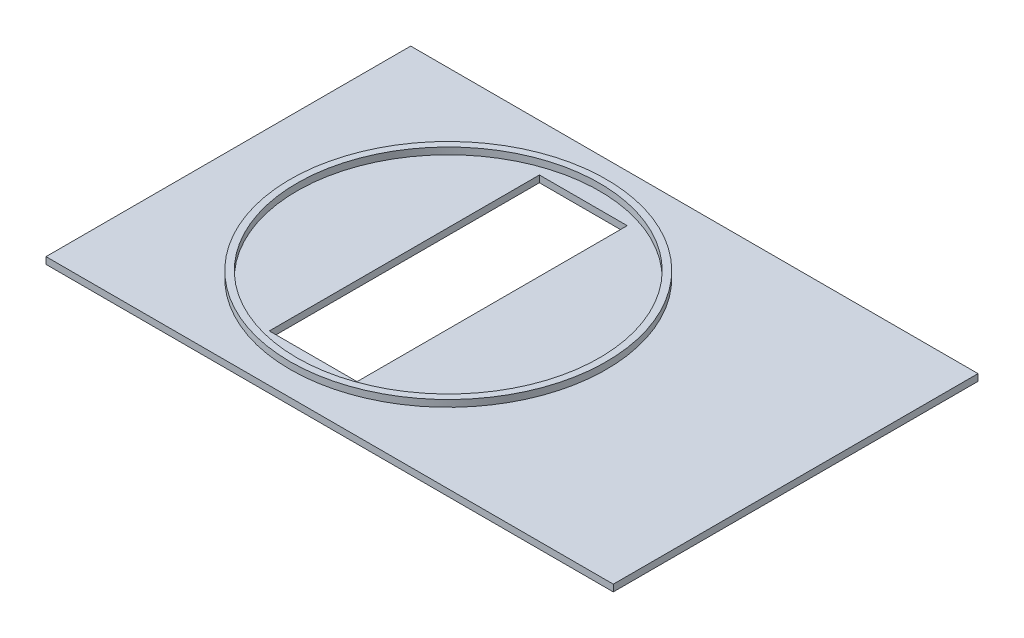
ISO-10303-21;
HEADER;
FILE_DESCRIPTION(('STEP AP214'),'2;1');
FILE_NAME('part.step','',(''),(''),'','','');
FILE_SCHEMA(('AUTOMOTIVE_DESIGN { 1 0 10303 214 1 1 1 1 }'));
ENDSEC;
DATA;
#1=APPLICATION_CONTEXT('core data for automotive mechanical design processes');
#2=APPLICATION_PROTOCOL_DEFINITION('international standard','automotive_design',2000,#1);
#3=PRODUCT_CONTEXT('',#1,'mechanical');
#4=PRODUCT('Part','Part','',(#3));
#5=PRODUCT_RELATED_PRODUCT_CATEGORY('part','',(#4));
#6=PRODUCT_DEFINITION_FORMATION('','',#4);
#7=PRODUCT_DEFINITION_CONTEXT('part definition',#1,'design');
#8=PRODUCT_DEFINITION('design','',#6,#7);
#9=PRODUCT_DEFINITION_SHAPE('','',#8);
#10=(LENGTH_UNIT() NAMED_UNIT(*) SI_UNIT(.MILLI.,.METRE.));
#11=(NAMED_UNIT(*) PLANE_ANGLE_UNIT() SI_UNIT($,.RADIAN.));
#12=(NAMED_UNIT(*) SI_UNIT($,.STERADIAN.) SOLID_ANGLE_UNIT());
#13=UNCERTAINTY_MEASURE_WITH_UNIT(LENGTH_MEASURE(1.E-05),#10,'distance_accuracy_value','');
#14=(GEOMETRIC_REPRESENTATION_CONTEXT(3) GLOBAL_UNCERTAINTY_ASSIGNED_CONTEXT((#13)) GLOBAL_UNIT_ASSIGNED_CONTEXT((#10,
#11,#12)) REPRESENTATION_CONTEXT('',''));
#15=CARTESIAN_POINT('',(0.,0.,0.));
#16=DIRECTION('',(0.,0.,1.));
#17=DIRECTION('',(1.,0.,0.));
#18=AXIS2_PLACEMENT_3D('',#15,#16,#17);
#19=CARTESIAN_POINT('',(0.,0.,0.));
#20=DIRECTION('',(0.,1.,0.));
#21=DIRECTION('',(0.,0.,1.));
#22=AXIS2_PLACEMENT_3D('',#19,#20,#21);
#23=PLANE('',#22);
#24=DIRECTION('',(0.,0.,-1.));
#25=VECTOR('',#24,1.);
#26=CARTESIAN_POINT('',(-65.,0.,0.));
#27=LINE('',#26,#25);
#28=CARTESIAN_POINT('',(-65.,0.,200.));
#29=VERTEX_POINT('',#28);
#30=CARTESIAN_POINT('',(-65.,0.,-200.));
#31=VERTEX_POINT('',#30);
#32=EDGE_CURVE('E145',#29,#31,#27,.T.);
#33=ORIENTED_EDGE('',*,*,#32,.T.);
#34=DIRECTION('',(1.,0.,0.));
#35=VECTOR('',#34,1.);
#36=CARTESIAN_POINT('',(0.,0.,-200.));
#37=LINE('',#36,#35);
#38=CARTESIAN_POINT('',(65.,0.,-200.));
#39=VERTEX_POINT('',#38);
#40=EDGE_CURVE('E148',#31,#39,#37,.T.);
#41=ORIENTED_EDGE('',*,*,#40,.T.);
#42=DIRECTION('',(0.,0.,1.));
#43=VECTOR('',#42,1.);
#44=CARTESIAN_POINT('',(65.,0.,0.));
#45=LINE('',#44,#43);
#46=CARTESIAN_POINT('',(65.,0.,200.));
#47=VERTEX_POINT('',#46);
#48=EDGE_CURVE('E111',#39,#47,#45,.T.);
#49=ORIENTED_EDGE('',*,*,#48,.T.);
#50=DIRECTION('',(-1.,0.,0.));
#51=VECTOR('',#50,1.);
#52=CARTESIAN_POINT('',(0.,0.,200.));
#53=LINE('',#52,#51);
#54=EDGE_CURVE('E151',#47,#29,#53,.T.);
#55=ORIENTED_EDGE('',*,*,#54,.T.);
#56=EDGE_LOOP('',(#33,#41,#49,#55));
#57=FACE_BOUND('',#56,.T.);
#58=CARTESIAN_POINT('',(0.,0.,0.));
#59=DIRECTION('',(0.,1.,0.));
#60=DIRECTION('',(0.,0.,1.));
#61=AXIS2_PLACEMENT_3D('',#58,#59,#60);
#62=CIRCLE('',#61,224.);
#63=CARTESIAN_POINT('',(0.,0.,224.));
#64=VERTEX_POINT('',#63);
#65=EDGE_CURVE('E11',#64,#64,#62,.F.);
#66=ORIENTED_EDGE('',*,*,#65,.F.);
#67=EDGE_LOOP('',(#66));
#68=FACE_BOUND('',#67,.T.);
#69=ADVANCED_FACE('F35',(#57,#68),#23,.T.);
#70=CARTESIAN_POINT('',(-65.,-10.,0.));
#71=DIRECTION('',(1.,0.,0.));
#72=DIRECTION('',(0.,0.,-1.));
#73=AXIS2_PLACEMENT_3D('',#70,#71,#72);
#74=PLANE('',#73);
#75=ORIENTED_EDGE('',*,*,#32,.F.);
#76=DIRECTION('',(0.,1.,0.));
#77=VECTOR('',#76,1.);
#78=CARTESIAN_POINT('',(-65.,-10.,200.));
#79=LINE('',#78,#77);
#80=CARTESIAN_POINT('',(-65.,-10.,200.));
#81=VERTEX_POINT('',#80);
#82=EDGE_CURVE('E44',#81,#29,#79,.T.);
#83=ORIENTED_EDGE('',*,*,#82,.F.);
#84=DIRECTION('',(0.,0.,-1.));
#85=VECTOR('',#84,1.);
#86=CARTESIAN_POINT('',(-65.,-10.,0.));
#87=LINE('',#86,#85);
#88=CARTESIAN_POINT('',(-65.,-10.,-200.));
#89=VERTEX_POINT('',#88);
#90=EDGE_CURVE('E125',#81,#89,#87,.T.);
#91=ORIENTED_EDGE('',*,*,#90,.T.);
#92=DIRECTION('',(0.,1.,0.));
#93=VECTOR('',#92,1.);
#94=CARTESIAN_POINT('',(-65.,-10.,-200.));
#95=LINE('',#94,#93);
#96=EDGE_CURVE('E116',#89,#31,#95,.T.);
#97=ORIENTED_EDGE('',*,*,#96,.T.);
#98=EDGE_LOOP('',(#75,#83,#91,#97));
#99=FACE_BOUND('',#98,.T.);
#100=ADVANCED_FACE('F211',(#99),#74,.T.);
#101=CARTESIAN_POINT('',(0.,-10.,200.));
#102=DIRECTION('',(0.,0.,-1.));
#103=DIRECTION('',(-1.,0.,0.));
#104=AXIS2_PLACEMENT_3D('',#101,#102,#103);
#105=PLANE('',#104);
#106=ORIENTED_EDGE('',*,*,#54,.F.);
#107=DIRECTION('',(0.,1.,0.));
#108=VECTOR('',#107,1.);
#109=CARTESIAN_POINT('',(65.,-10.,200.));
#110=LINE('',#109,#108);
#111=CARTESIAN_POINT('',(65.,-10.,200.));
#112=VERTEX_POINT('',#111);
#113=EDGE_CURVE('E80',#112,#47,#110,.T.);
#114=ORIENTED_EDGE('',*,*,#113,.F.);
#115=DIRECTION('',(-1.,0.,0.));
#116=VECTOR('',#115,1.);
#117=CARTESIAN_POINT('',(0.,-10.,200.));
#118=LINE('',#117,#116);
#119=EDGE_CURVE('E122',#112,#81,#118,.T.);
#120=ORIENTED_EDGE('',*,*,#119,.T.);
#121=ORIENTED_EDGE('',*,*,#82,.T.);
#122=EDGE_LOOP('',(#106,#114,#120,#121));
#123=FACE_BOUND('',#122,.T.);
#124=ADVANCED_FACE('F216',(#123),#105,.T.);
#125=CARTESIAN_POINT('',(65.,-10.,0.));
#126=DIRECTION('',(-1.,0.,0.));
#127=DIRECTION('',(0.,0.,1.));
#128=AXIS2_PLACEMENT_3D('',#125,#126,#127);
#129=PLANE('',#128);
#130=ORIENTED_EDGE('',*,*,#48,.F.);
#131=DIRECTION('',(0.,1.,0.));
#132=VECTOR('',#131,1.);
#133=CARTESIAN_POINT('',(65.,-10.,-200.));
#134=LINE('',#133,#132);
#135=CARTESIAN_POINT('',(65.,-10.,-200.));
#136=VERTEX_POINT('',#135);
#137=EDGE_CURVE('E106',#136,#39,#134,.T.);
#138=ORIENTED_EDGE('',*,*,#137,.F.);
#139=DIRECTION('',(0.,0.,1.));
#140=VECTOR('',#139,1.);
#141=CARTESIAN_POINT('',(65.,-10.,0.));
#142=LINE('',#141,#140);
#143=EDGE_CURVE('E109',#136,#112,#142,.T.);
#144=ORIENTED_EDGE('',*,*,#143,.T.);
#145=ORIENTED_EDGE('',*,*,#113,.T.);
#146=EDGE_LOOP('',(#130,#138,#144,#145));
#147=FACE_BOUND('',#146,.T.);
#148=ADVANCED_FACE('F108',(#147),#129,.T.);
#149=CARTESIAN_POINT('',(514.396103797449,-10.,0.));
#150=DIRECTION('',(-1.,0.,0.));
#151=DIRECTION('',(0.,0.,1.));
#152=AXIS2_PLACEMENT_3D('',#149,#150,#151);
#153=PLANE('',#152);
#154=DIRECTION('',(0.,0.,1.));
#155=VECTOR('',#154,1.);
#156=CARTESIAN_POINT('',(514.396103797449,0.,0.));
#157=LINE('',#156,#155);
#158=CARTESIAN_POINT('',(514.396103797449,0.,-270.));
#159=VERTEX_POINT('',#158);
#160=CARTESIAN_POINT('',(514.396103797449,0.,270.));
#161=VERTEX_POINT('',#160);
#162=EDGE_CURVE('E133',#159,#161,#157,.T.);
#163=ORIENTED_EDGE('',*,*,#162,.T.);
#164=DIRECTION('',(0.,1.,0.));
#165=VECTOR('',#164,1.);
#166=CARTESIAN_POINT('',(514.396103797449,-10.,270.));
#167=LINE('',#166,#165);
#168=CARTESIAN_POINT('',(514.396103797449,-10.,270.));
#169=VERTEX_POINT('',#168);
#170=EDGE_CURVE('E158',#169,#161,#167,.T.);
#171=ORIENTED_EDGE('',*,*,#170,.F.);
#172=DIRECTION('',(0.,0.,1.));
#173=VECTOR('',#172,1.);
#174=CARTESIAN_POINT('',(514.396103797449,-10.,0.));
#175=LINE('',#174,#173);
#176=CARTESIAN_POINT('',(514.396103797449,-10.,-270.));
#177=VERTEX_POINT('',#176);
#178=EDGE_CURVE('E154',#177,#169,#175,.T.);
#179=ORIENTED_EDGE('',*,*,#178,.F.);
#180=DIRECTION('',(0.,1.,0.));
#181=VECTOR('',#180,1.);
#182=CARTESIAN_POINT('',(514.396103797449,-10.,-270.));
#183=LINE('',#182,#181);
#184=EDGE_CURVE('E132',#177,#159,#183,.T.);
#185=ORIENTED_EDGE('',*,*,#184,.T.);
#186=EDGE_LOOP('',(#163,#171,#179,#185));
#187=FACE_BOUND('',#186,.T.);
#188=ADVANCED_FACE('F37',(#187),#153,.F.);
#189=CARTESIAN_POINT('',(0.,-10.,270.));
#190=DIRECTION('',(0.,0.,1.));
#191=DIRECTION('',(1.,0.,0.));
#192=AXIS2_PLACEMENT_3D('',#189,#190,#191);
#193=PLANE('',#192);
#194=DIRECTION('',(1.,0.,0.));
#195=VECTOR('',#194,1.);
#196=CARTESIAN_POINT('',(0.,0.,270.));
#197=LINE('',#196,#195);
#198=CARTESIAN_POINT('',(-325.603896202551,0.,270.));
#199=VERTEX_POINT('',#198);
#200=EDGE_CURVE('E142',#199,#161,#197,.T.);
#201=ORIENTED_EDGE('',*,*,#200,.F.);
#202=DIRECTION('',(0.,1.,0.));
#203=VECTOR('',#202,1.);
#204=CARTESIAN_POINT('',(-325.603896202551,-10.,270.));
#205=LINE('',#204,#203);
#206=CARTESIAN_POINT('',(-325.603896202551,-10.,270.));
#207=VERTEX_POINT('',#206);
#208=EDGE_CURVE('E160',#207,#199,#205,.T.);
#209=ORIENTED_EDGE('',*,*,#208,.F.);
#210=DIRECTION('',(1.,0.,0.));
#211=VECTOR('',#210,1.);
#212=CARTESIAN_POINT('',(0.,-10.,270.));
#213=LINE('',#212,#211);
#214=EDGE_CURVE('E127',#207,#169,#213,.T.);
#215=ORIENTED_EDGE('',*,*,#214,.T.);
#216=ORIENTED_EDGE('',*,*,#170,.T.);
#217=EDGE_LOOP('',(#201,#209,#215,#216));
#218=FACE_BOUND('',#217,.T.);
#219=ADVANCED_FACE('F175',(#218),#193,.T.);
#220=CARTESIAN_POINT('',(-325.603896202551,-10.,0.));
#221=DIRECTION('',(-1.,0.,0.));
#222=DIRECTION('',(0.,0.,1.));
#223=AXIS2_PLACEMENT_3D('',#220,#221,#222);
#224=PLANE('',#223);
#225=DIRECTION('',(0.,0.,1.));
#226=VECTOR('',#225,1.);
#227=CARTESIAN_POINT('',(-325.603896202551,0.,0.));
#228=LINE('',#227,#226);
#229=CARTESIAN_POINT('',(-325.603896202551,0.,-270.));
#230=VERTEX_POINT('',#229);
#231=EDGE_CURVE('E139',#230,#199,#228,.T.);
#232=ORIENTED_EDGE('',*,*,#231,.F.);
#233=DIRECTION('',(0.,1.,0.));
#234=VECTOR('',#233,1.);
#235=CARTESIAN_POINT('',(-325.603896202551,-10.,-270.));
#236=LINE('',#235,#234);
#237=CARTESIAN_POINT('',(-325.603896202551,-10.,-270.));
#238=VERTEX_POINT('',#237);
#239=EDGE_CURVE('E162',#238,#230,#236,.T.);
#240=ORIENTED_EDGE('',*,*,#239,.F.);
#241=DIRECTION('',(0.,0.,1.));
#242=VECTOR('',#241,1.);
#243=CARTESIAN_POINT('',(-325.603896202551,-10.,0.));
#244=LINE('',#243,#242);
#245=EDGE_CURVE('E179',#238,#207,#244,.T.);
#246=ORIENTED_EDGE('',*,*,#245,.T.);
#247=ORIENTED_EDGE('',*,*,#208,.T.);
#248=EDGE_LOOP('',(#232,#240,#246,#247));
#249=FACE_BOUND('',#248,.T.);
#250=ADVANCED_FACE('F279',(#249),#224,.T.);
#251=CARTESIAN_POINT('',(0.,-10.,-270.));
#252=DIRECTION('',(0.,0.,1.));
#253=DIRECTION('',(1.,0.,0.));
#254=AXIS2_PLACEMENT_3D('',#251,#252,#253);
#255=PLANE('',#254);
#256=DIRECTION('',(1.,0.,0.));
#257=VECTOR('',#256,1.);
#258=CARTESIAN_POINT('',(0.,0.,-270.));
#259=LINE('',#258,#257);
#260=EDGE_CURVE('E136',#230,#159,#259,.T.);
#261=ORIENTED_EDGE('',*,*,#260,.T.);
#262=ORIENTED_EDGE('',*,*,#184,.F.);
#263=DIRECTION('',(1.,0.,0.));
#264=VECTOR('',#263,1.);
#265=CARTESIAN_POINT('',(0.,-10.,-270.));
#266=LINE('',#265,#264);
#267=EDGE_CURVE('E93',#238,#177,#266,.T.);
#268=ORIENTED_EDGE('',*,*,#267,.F.);
#269=ORIENTED_EDGE('',*,*,#239,.T.);
#270=EDGE_LOOP('',(#261,#262,#268,#269));
#271=FACE_BOUND('',#270,.T.);
#272=ADVANCED_FACE('F269',(#271),#255,.F.);
#273=CARTESIAN_POINT('',(0.,-10.,-200.));
#274=DIRECTION('',(0.,0.,1.));
#275=DIRECTION('',(1.,0.,0.));
#276=AXIS2_PLACEMENT_3D('',#273,#274,#275);
#277=PLANE('',#276);
#278=ORIENTED_EDGE('',*,*,#40,.F.);
#279=ORIENTED_EDGE('',*,*,#96,.F.);
#280=DIRECTION('',(1.,0.,0.));
#281=VECTOR('',#280,1.);
#282=CARTESIAN_POINT('',(0.,-10.,-200.));
#283=LINE('',#282,#281);
#284=EDGE_CURVE('E121',#89,#136,#283,.T.);
#285=ORIENTED_EDGE('',*,*,#284,.T.);
#286=ORIENTED_EDGE('',*,*,#137,.T.);
#287=EDGE_LOOP('',(#278,#279,#285,#286));
#288=FACE_BOUND('',#287,.T.);
#289=ADVANCED_FACE('F124',(#288),#277,.T.);
#290=CARTESIAN_POINT('',(0.,-10.,0.));
#291=DIRECTION('',(0.,1.,0.));
#292=DIRECTION('',(0.,0.,1.));
#293=AXIS2_PLACEMENT_3D('',#290,#291,#292);
#294=PLANE('',#293);
#295=ORIENTED_EDGE('',*,*,#178,.T.);
#296=ORIENTED_EDGE('',*,*,#214,.F.);
#297=ORIENTED_EDGE('',*,*,#245,.F.);
#298=ORIENTED_EDGE('',*,*,#267,.T.);
#299=EDGE_LOOP('',(#295,#296,#297,#298));
#300=FACE_BOUND('',#299,.T.);
#301=ORIENTED_EDGE('',*,*,#90,.F.);
#302=ORIENTED_EDGE('',*,*,#119,.F.);
#303=ORIENTED_EDGE('',*,*,#143,.F.);
#304=ORIENTED_EDGE('',*,*,#284,.F.);
#305=EDGE_LOOP('',(#301,#302,#303,#304));
#306=FACE_BOUND('',#305,.T.);
#307=ADVANCED_FACE('F120',(#300,#306),#294,.F.);
#308=CARTESIAN_POINT('',(0.,0.,0.));
#309=DIRECTION('',(0.,1.,0.));
#310=DIRECTION('',(0.,0.,1.));
#311=AXIS2_PLACEMENT_3D('',#308,#309,#310);
#312=CIRCLE('',#311,234.);
#313=CARTESIAN_POINT('',(0.,0.,234.));
#314=VERTEX_POINT('',#313);
#315=EDGE_CURVE('E184',#314,#314,#312,.T.);
#316=ORIENTED_EDGE('',*,*,#315,.F.);
#317=EDGE_LOOP('',(#316));
#318=FACE_BOUND('',#317,.T.);
#319=ORIENTED_EDGE('',*,*,#162,.F.);
#320=ORIENTED_EDGE('',*,*,#260,.F.);
#321=ORIENTED_EDGE('',*,*,#231,.T.);
#322=ORIENTED_EDGE('',*,*,#200,.T.);
#323=EDGE_LOOP('',(#319,#320,#321,#322));
#324=FACE_BOUND('',#323,.T.);
#325=ADVANCED_FACE('F171',(#318,#324),#23,.T.);
#326=CARTESIAN_POINT('',(0.,10.,0.));
#327=DIRECTION('',(0.,-1.,0.));
#328=DIRECTION('',(0.,0.,-1.));
#329=AXIS2_PLACEMENT_3D('',#326,#327,#328);
#330=CYLINDRICAL_SURFACE('',#329,234.);
#331=CARTESIAN_POINT('',(0.,10.,0.));
#332=DIRECTION('',(0.,1.,0.));
#333=DIRECTION('',(0.,0.,1.));
#334=AXIS2_PLACEMENT_3D('',#331,#332,#333);
#335=CIRCLE('',#334,234.);
#336=CARTESIAN_POINT('',(0.,10.,234.));
#337=VERTEX_POINT('',#336);
#338=EDGE_CURVE('E187',#337,#337,#335,.T.);
#339=ORIENTED_EDGE('',*,*,#338,.F.);
#340=EDGE_LOOP('',(#339));
#341=FACE_BOUND('',#340,.T.);
#342=ORIENTED_EDGE('',*,*,#315,.T.);
#343=EDGE_LOOP('',(#342));
#344=FACE_BOUND('',#343,.T.);
#345=ADVANCED_FACE('F196',(#341,#344),#330,.T.);
#346=CARTESIAN_POINT('',(0.,10.,0.));
#347=DIRECTION('',(0.,-1.,0.));
#348=DIRECTION('',(0.,0.,-1.));
#349=AXIS2_PLACEMENT_3D('',#346,#347,#348);
#350=CYLINDRICAL_SURFACE('',#349,224.);
#351=CARTESIAN_POINT('',(0.,10.,0.));
#352=DIRECTION('',(0.,1.,0.));
#353=DIRECTION('',(0.,0.,1.));
#354=AXIS2_PLACEMENT_3D('',#351,#352,#353);
#355=CIRCLE('',#354,224.);
#356=CARTESIAN_POINT('',(0.,10.,224.));
#357=VERTEX_POINT('',#356);
#358=EDGE_CURVE('E137',#357,#357,#355,.T.);
#359=ORIENTED_EDGE('',*,*,#358,.T.);
#360=EDGE_LOOP('',(#359));
#361=FACE_BOUND('',#360,.T.);
#362=ORIENTED_EDGE('',*,*,#65,.T.);
#363=EDGE_LOOP('',(#362));
#364=FACE_BOUND('',#363,.T.);
#365=ADVANCED_FACE('F199',(#361,#364),#350,.F.);
#366=CARTESIAN_POINT('',(0.,10.,0.));
#367=DIRECTION('',(0.,1.,0.));
#368=DIRECTION('',(0.,0.,1.));
#369=AXIS2_PLACEMENT_3D('',#366,#367,#368);
#370=PLANE('',#369);
#371=ORIENTED_EDGE('',*,*,#338,.T.);
#372=EDGE_LOOP('',(#371));
#373=FACE_BOUND('',#372,.T.);
#374=ORIENTED_EDGE('',*,*,#358,.F.);
#375=EDGE_LOOP('',(#374));
#376=FACE_BOUND('',#375,.T.);
#377=ADVANCED_FACE('F193',(#373,#376),#370,.T.);
#378=CLOSED_SHELL('',(#69,#100,#124,#148,#188,#219,#250,#272,#289,#307,#325,#345,#365,#377));
#379=MANIFOLD_SOLID_BREP('B2',#378);
#380=ADVANCED_BREP_SHAPE_REPRESENTATION('',(#18,#379),#14);
#381=SHAPE_DEFINITION_REPRESENTATION(#9,#380);
ENDSEC;
END-ISO-10303-21;
